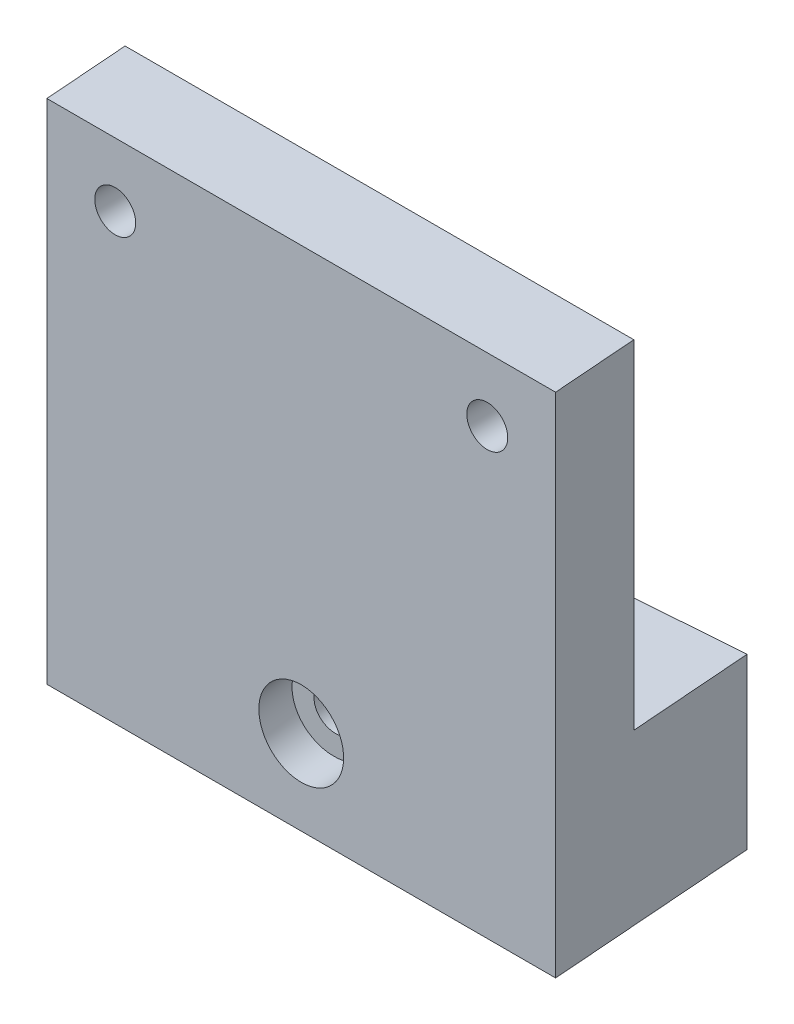
ISO-10303-21;
HEADER;
FILE_DESCRIPTION(('STEP AP214'),'2;1');
FILE_NAME('part.step','',(''),(''),'','','');
FILE_SCHEMA(('AUTOMOTIVE_DESIGN { 1 0 10303 214 1 1 1 1 }'));
ENDSEC;
DATA;
#1=APPLICATION_CONTEXT('core data for automotive mechanical design processes');
#2=APPLICATION_PROTOCOL_DEFINITION('international standard','automotive_design',2000,#1);
#3=PRODUCT_CONTEXT('',#1,'mechanical');
#4=PRODUCT('Part','Part','',(#3));
#5=PRODUCT_RELATED_PRODUCT_CATEGORY('part','',(#4));
#6=PRODUCT_DEFINITION_FORMATION('','',#4);
#7=PRODUCT_DEFINITION_CONTEXT('part definition',#1,'design');
#8=PRODUCT_DEFINITION('design','',#6,#7);
#9=PRODUCT_DEFINITION_SHAPE('','',#8);
#10=(LENGTH_UNIT() NAMED_UNIT(*) SI_UNIT(.MILLI.,.METRE.));
#11=(NAMED_UNIT(*) PLANE_ANGLE_UNIT() SI_UNIT($,.RADIAN.));
#12=(NAMED_UNIT(*) SI_UNIT($,.STERADIAN.) SOLID_ANGLE_UNIT());
#13=UNCERTAINTY_MEASURE_WITH_UNIT(LENGTH_MEASURE(1.E-05),#10,'distance_accuracy_value','');
#14=(GEOMETRIC_REPRESENTATION_CONTEXT(3) GLOBAL_UNCERTAINTY_ASSIGNED_CONTEXT((#13)) GLOBAL_UNIT_ASSIGNED_CONTEXT((#10,
#11,#12)) REPRESENTATION_CONTEXT('',''));
#15=CARTESIAN_POINT('',(0.,0.,0.));
#16=DIRECTION('',(0.,0.,1.));
#17=DIRECTION('',(1.,0.,0.));
#18=AXIS2_PLACEMENT_3D('',#15,#16,#17);
#19=CARTESIAN_POINT('',(0.,0.,332.955129639711));
#20=DIRECTION('',(0.,0.,1.));
#21=DIRECTION('',(1.,0.,0.));
#22=AXIS2_PLACEMENT_3D('',#19,#20,#21);
#23=PLANE('',#22);
#24=DIRECTION('',(-1.,0.,0.));
#25=VECTOR('',#24,1.);
#26=CARTESIAN_POINT('',(31.201050069516,-25.4,332.955129639711));
#27=LINE('',#26,#25);
#28=CARTESIAN_POINT('',(101.38564669068,-25.4,332.955129639711));
#29=VERTEX_POINT('',#28);
#30=CARTESIAN_POINT('',(24.9716347229783,-25.4,332.955129639711));
#31=VERTEX_POINT('',#30);
#32=EDGE_CURVE('E102',#29,#31,#27,.T.);
#33=ORIENTED_EDGE('',*,*,#32,.F.);
#34=DIRECTION('',(0.,1.,0.));
#35=VECTOR('',#34,1.);
#36=CARTESIAN_POINT('',(101.38564669068,-7.22333933655499E-13,332.955129639711));
#37=LINE('',#36,#35);
#38=CARTESIAN_POINT('',(101.38564669068,50.8,332.955129639711));
#39=VERTEX_POINT('',#38);
#40=EDGE_CURVE('E145',#29,#39,#37,.T.);
#41=ORIENTED_EDGE('',*,*,#40,.T.);
#42=DIRECTION('',(1.,0.,0.));
#43=VECTOR('',#42,1.);
#44=CARTESIAN_POINT('',(101.38564669068,50.8,332.955129639711));
#45=LINE('',#44,#43);
#46=CARTESIAN_POINT('',(24.9716347229785,50.8,332.955129639711));
#47=VERTEX_POINT('',#46);
#48=EDGE_CURVE('E181',#47,#39,#45,.T.);
#49=ORIENTED_EDGE('',*,*,#48,.F.);
#50=DIRECTION('',(0.,-1.,0.));
#51=VECTOR('',#50,1.);
#52=CARTESIAN_POINT('',(24.9716347229785,0.,332.955129639711));
#53=LINE('',#52,#51);
#54=EDGE_CURVE('E155',#47,#31,#53,.T.);
#55=ORIENTED_EDGE('',*,*,#54,.T.);
#56=EDGE_LOOP('',(#33,#41,#49,#55));
#57=FACE_BOUND('',#56,.T.);
#58=CARTESIAN_POINT('',(91.1186407068292,41.275,332.955129639711));
#59=DIRECTION('',(0.,0.,1.));
#60=DIRECTION('',(1.,0.,0.));
#61=AXIS2_PLACEMENT_3D('',#58,#59,#60);
#62=CIRCLE('',#61,3.0734);
#63=CARTESIAN_POINT('',(94.1920407068292,41.275,332.955129639711));
#64=VERTEX_POINT('',#63);
#65=EDGE_CURVE('E228',#64,#64,#62,.T.);
#66=ORIENTED_EDGE('',*,*,#65,.F.);
#67=EDGE_LOOP('',(#66));
#68=FACE_BOUND('',#67,.T.);
#69=CARTESIAN_POINT('',(35.2386407068292,41.275,332.955129639711));
#70=DIRECTION('',(0.,0.,1.));
#71=DIRECTION('',(1.,0.,0.));
#72=AXIS2_PLACEMENT_3D('',#69,#70,#71);
#73=CIRCLE('',#72,3.0734);
#74=CARTESIAN_POINT('',(38.3120407068292,41.275,332.955129639711));
#75=VERTEX_POINT('',#74);
#76=EDGE_CURVE('E177',#75,#75,#73,.T.);
#77=ORIENTED_EDGE('',*,*,#76,.F.);
#78=EDGE_LOOP('',(#77));
#79=FACE_BOUND('',#78,.T.);
#80=DIRECTION('',(0.,-1.,0.));
#81=VECTOR('',#80,1.);
#82=CARTESIAN_POINT('',(69.5286407068283,0.,332.955129639711));
#83=LINE('',#82,#81);
#84=CARTESIAN_POINT('',(69.5286407068283,-12.2268346567049,332.955129639711));
#85=VERTEX_POINT('',#84);
#86=CARTESIAN_POINT('',(69.5286407068283,-13.1766669993983,332.955129639711));
#87=VERTEX_POINT('',#86);
#88=EDGE_CURVE('E51',#85,#87,#83,.T.);
#89=ORIENTED_EDGE('',*,*,#88,.T.);
#90=CARTESIAN_POINT('',(63.1786407068292,-12.7017508280516,332.955129639711));
#91=DIRECTION('',(0.,0.,1.));
#92=DIRECTION('',(1.,0.,0.));
#93=AXIS2_PLACEMENT_3D('',#90,#91,#92);
#94=ELLIPSE('',#93,6.36783433064178,6.35);
#95=EDGE_CURVE('E12',#87,#85,#94,.F.);
#96=ORIENTED_EDGE('',*,*,#95,.T.);
#97=EDGE_LOOP('',(#89,#96));
#98=FACE_BOUND('',#97,.T.);
#99=ADVANCED_FACE('F42',(#57,#68,#79,#98),#23,.T.);
#100=CARTESIAN_POINT('',(31.201050069516,0.,416.014000926879));
#101=DIRECTION('',(0.,-1.,0.));
#102=DIRECTION('',(0.,0.,-1.));
#103=AXIS2_PLACEMENT_3D('',#100,#101,#102);
#104=PLANE('',#103);
#105=DIRECTION('',(-1.,0.,0.));
#106=VECTOR('',#105,1.);
#107=CARTESIAN_POINT('',(24.0191347229785,0.,320.255129639711));
#108=LINE('',#107,#106);
#109=CARTESIAN_POINT('',(100.43314669068,0.,320.255129639711));
#110=VERTEX_POINT('',#109);
#111=CARTESIAN_POINT('',(24.0191347229785,0.,320.255129639711));
#112=VERTEX_POINT('',#111);
#113=EDGE_CURVE('E65',#110,#112,#108,.T.);
#114=ORIENTED_EDGE('',*,*,#113,.F.);
#115=DIRECTION('',(-0.0747899482416342,0.,-0.997199309888456));
#116=VECTOR('',#115,1.);
#117=CARTESIAN_POINT('',(107.187637483017,0.,410.315006870867));
#118=LINE('',#117,#116);
#119=CARTESIAN_POINT('',(99.0532221364789,0.,301.856135583698));
#120=VERTEX_POINT('',#119);
#121=EDGE_CURVE('E170',#110,#120,#118,.T.);
#122=ORIENTED_EDGE('',*,*,#121,.T.);
#123=DIRECTION('',(-0.997199309888457,0.,0.0747899482416342));
#124=VECTOR('',#123,1.);
#125=CARTESIAN_POINT('',(23.0666347229783,0.,307.555129639711));
#126=LINE('',#125,#124);
#127=CARTESIAN_POINT('',(23.0666347229785,0.,307.555129639711));
#128=VERTEX_POINT('',#127);
#129=EDGE_CURVE('E213',#120,#128,#126,.T.);
#130=ORIENTED_EDGE('',*,*,#129,.T.);
#131=DIRECTION('',(-0.0747899482416342,0.,-0.997199309888456));
#132=VECTOR('',#131,1.);
#133=CARTESIAN_POINT('',(31.2010500695162,0.,416.014000926879));
#134=LINE('',#133,#132);
#135=EDGE_CURVE('E163',#112,#128,#134,.T.);
#136=ORIENTED_EDGE('',*,*,#135,.F.);
#137=EDGE_LOOP('',(#114,#122,#130,#136));
#138=FACE_BOUND('',#137,.T.);
#139=ADVANCED_FACE('F109',(#138),#104,.F.);
#140=CARTESIAN_POINT('',(69.1943437762664,-12.7017508280516,413.164503898873));
#141=DIRECTION('',(-0.0747899482416342,0.,-0.997199309888456));
#142=DIRECTION('',(-0.997199309888457,0.,0.0747899482416342));
#143=AXIS2_PLACEMENT_3D('',#140,#141,#142);
#144=CYLINDRICAL_SURFACE('',#143,3.26390000000057);
#145=CARTESIAN_POINT('',(62.739243491368,-12.7017508280516,327.096500100228));
#146=DIRECTION('',(-0.0747899482416342,0.,-0.997199309888456));
#147=DIRECTION('',(-0.997199309888456,0.,0.0747899482416342));
#148=AXIS2_PLACEMENT_3D('',#145,#146,#147);
#149=CIRCLE('',#148,3.26390000000057);
#150=CARTESIAN_POINT('',(59.4844846638225,-12.7017508280516,327.340607012294));
#151=VERTEX_POINT('',#150);
#152=EDGE_CURVE('E46',#151,#151,#149,.T.);
#153=CARTESIAN_POINT('',(61.0599284297287,-12.7017508280516,304.705632611704));
#154=DIRECTION('',(0.0747899482416342,0.,0.997199309888456));
#155=DIRECTION('',(0.997199309888456,0.,-0.0747899482416342));
#156=AXIS2_PLACEMENT_3D('',#153,#154,#155);
#157=CIRCLE('',#156,3.26390000000057);
#158=CARTESIAN_POINT('',(57.8051696021832,-12.7017508280516,304.94973952377));
#159=VERTEX_POINT('',#158);
#160=EDGE_CURVE('E154',#159,#159,#157,.T.);
#161=CARTESIAN_POINT('',(59.4844846638225,-12.7017508280516,327.340607012294));
#162=CARTESIAN_POINT('',(59.4669917985971,-12.7017508280516,327.107368809289));
#163=CARTESIAN_POINT('',(59.4494989333717,-12.7017508280516,326.874130606283));
#164=CARTESIAN_POINT('',(59.4145132029209,-12.7017508280516,326.407654200272));
#165=CARTESIAN_POINT('',(59.3970203376955,-12.7017508280516,326.174415997267));
#166=CARTESIAN_POINT('',(59.3620346072446,-12.7017508280516,325.707939591256));
#167=CARTESIAN_POINT('',(59.3445417420192,-12.7017508280516,325.474701388251));
#168=CARTESIAN_POINT('',(59.3095560115684,-12.7017508280516,325.00822498224));
#169=CARTESIAN_POINT('',(59.292063146343,-12.7017508280516,324.774986779234));
#170=CARTESIAN_POINT('',(59.2570774158922,-12.7017508280516,324.308510373223));
#171=CARTESIAN_POINT('',(59.2395845506668,-12.7017508280516,324.075272170218));
#172=CARTESIAN_POINT('',(59.204598820216,-12.7017508280516,323.608795764207));
#173=CARTESIAN_POINT('',(59.1871059549906,-12.7017508280516,323.375557561201));
#174=CARTESIAN_POINT('',(59.1521202245397,-12.7017508280516,322.90908115519));
#175=CARTESIAN_POINT('',(59.1346273593143,-12.7017508280516,322.675842952185));
#176=CARTESIAN_POINT('',(59.0996416288635,-12.7017508280516,322.209366546174));
#177=CARTESIAN_POINT('',(59.0821487636381,-12.7017508280516,321.976128343169));
#178=CARTESIAN_POINT('',(59.0471630331873,-12.7017508280516,321.509651937158));
#179=CARTESIAN_POINT('',(59.0296701679619,-12.7017508280516,321.276413734152));
#180=CARTESIAN_POINT('',(58.994684437511,-12.7017508280516,320.809937328141));
#181=CARTESIAN_POINT('',(58.9771915722856,-12.7017508280516,320.576699125136));
#182=CARTESIAN_POINT('',(58.9422058418348,-12.7017508280516,320.110222719125));
#183=CARTESIAN_POINT('',(58.9247129766094,-12.7017508280516,319.87698451612));
#184=CARTESIAN_POINT('',(58.8897272461586,-12.7017508280516,319.410508110109));
#185=CARTESIAN_POINT('',(58.8722343809332,-12.7017508280516,319.177269907103));
#186=CARTESIAN_POINT('',(58.8372486504824,-12.7017508280516,318.710793501092));
#187=CARTESIAN_POINT('',(58.819755785257,-12.7017508280516,318.477555298087));
#188=CARTESIAN_POINT('',(58.7847700548061,-12.7017508280516,318.011078892076));
#189=CARTESIAN_POINT('',(58.7672771895807,-12.7017508280516,317.77784068907));
#190=CARTESIAN_POINT('',(58.7322914591299,-12.7017508280516,317.311364283059));
#191=CARTESIAN_POINT('',(58.7147985939045,-12.7017508280516,317.078126080054));
#192=CARTESIAN_POINT('',(58.6798128634537,-12.7017508280516,316.611649674043));
#193=CARTESIAN_POINT('',(58.6623199982283,-12.7017508280516,316.378411471038));
#194=CARTESIAN_POINT('',(58.6273342677774,-12.7017508280516,315.911935065027));
#195=CARTESIAN_POINT('',(58.609841402552,-12.7017508280516,315.678696862021));
#196=CARTESIAN_POINT('',(58.5748556721012,-12.7017508280516,315.21222045601));
#197=CARTESIAN_POINT('',(58.5573628068758,-12.7017508280516,314.978982253005));
#198=CARTESIAN_POINT('',(58.522377076425,-12.7017508280516,314.512505846994));
#199=CARTESIAN_POINT('',(58.5048842111996,-12.7017508280516,314.279267643988));
#200=CARTESIAN_POINT('',(58.4698984807488,-12.7017508280516,313.812791237978));
#201=CARTESIAN_POINT('',(58.4524056155234,-12.7017508280516,313.579553034972));
#202=CARTESIAN_POINT('',(58.4174198850725,-12.7017508280516,313.113076628961));
#203=CARTESIAN_POINT('',(58.3999270198471,-12.7017508280516,312.879838425956));
#204=CARTESIAN_POINT('',(58.3649412893963,-12.7017508280516,312.413362019945));
#205=CARTESIAN_POINT('',(58.3474484241709,-12.7017508280516,312.180123816939));
#206=CARTESIAN_POINT('',(58.3124626937201,-12.7017508280516,311.713647410928));
#207=CARTESIAN_POINT('',(58.2949698284947,-12.7017508280516,311.480409207923));
#208=CARTESIAN_POINT('',(58.2599840980439,-12.7017508280516,311.013932801912));
#209=CARTESIAN_POINT('',(58.2424912328184,-12.7017508280516,310.780694598907));
#210=CARTESIAN_POINT('',(58.2075055023676,-12.7017508280516,310.314218192896));
#211=CARTESIAN_POINT('',(58.1900126371422,-12.7017508280516,310.08097998989));
#212=CARTESIAN_POINT('',(58.1550269066914,-12.7017508280516,309.614503583879));
#213=CARTESIAN_POINT('',(58.137534041466,-12.7017508280516,309.381265380874));
#214=CARTESIAN_POINT('',(58.1025483110152,-12.7017508280516,308.914788974863));
#215=CARTESIAN_POINT('',(58.0850554457898,-12.7017508280516,308.681550771857));
#216=CARTESIAN_POINT('',(58.0500697153389,-12.7017508280516,308.215074365846));
#217=CARTESIAN_POINT('',(58.0325768501135,-12.7017508280516,307.981836162841));
#218=CARTESIAN_POINT('',(57.9975911196627,-12.7017508280516,307.51535975683));
#219=CARTESIAN_POINT('',(57.9800982544373,-12.7017508280516,307.282121553825));
#220=CARTESIAN_POINT('',(57.9451125239865,-12.7017508280516,306.815645147814));
#221=CARTESIAN_POINT('',(57.9276196587611,-12.7017508280516,306.582406944808));
#222=CARTESIAN_POINT('',(57.8926339283103,-12.7017508280516,306.115930538797));
#223=CARTESIAN_POINT('',(57.8751410630848,-12.7017508280516,305.882692335792));
#224=CARTESIAN_POINT('',(57.840155332634,-12.7017508280516,305.416215929781));
#225=CARTESIAN_POINT('',(57.8226624674086,-12.7017508280516,305.182977726776));
#226=CARTESIAN_POINT('',(57.8051696021832,-12.7017508280516,304.94973952377));
#227=B_SPLINE_CURVE_WITH_KNOTS('',3,(#161,#162,#163,#164,#165,#166,#167,#168,#169,#170,#171,
#172,#173,#174,#175,#176,#177,#178,#179,#180,#181,#182,#183,#184,#185,#186,#187,#188,#189,#190,
#191,#192,#193,#194,#195,#196,#197,#198,#199,#200,#201,#202,#203,#204,#205,#206,#207,#208,#209,
#210,#211,#212,#213,#214,#215,#216,#217,#218,#219,#220,#221,#222,#223,#224,#225,#226),
.UNSPECIFIED.,.F.,.F.,(4,2,2,2,2,2,2,2,2,2,2,2,2,2,2,2,2,2,2,2,2,2,2,2,2,2,2,2,2,2,2,2,4),(0.,
0.701679796684455,1.40335959336885,2.10503939005331,2.80671918673771,3.50839898342211,
4.21007878010656,4.91175857679096,5.61343837347542,6.31511817015982,7.01679796684427,
7.71847776352867,8.42015756021307,9.12183735689752,9.82351715358192,10.5251969502663,
11.2268767469508,11.9285565436352,12.6302363403196,13.331916137004,14.0335959336885,
14.7352757303729,15.4369555270573,16.1386353237417,16.8403151204261,17.5419949171106,
18.243674713795,18.9453545104794,19.6470343071638,20.3487141038482,21.0503939005327,
21.7520736972171,22.4537534939016),.UNSPECIFIED.);
#228=EDGE_CURVE('BSEAM44',#151,#159,#227,.T.);
#229=ORIENTED_EDGE('',*,*,#152,.F.);
#230=ORIENTED_EDGE('',*,*,#160,.F.);
#231=ORIENTED_EDGE('',*,*,#228,.T.);
#232=ORIENTED_EDGE('',*,*,#228,.F.);
#233=EDGE_LOOP('',(#229,#231,#230,#232));
#234=FACE_BOUND('',#233,.T.);
#235=ADVANCED_FACE('F44',(#234),#144,.F.);
#236=CARTESIAN_POINT('',(23.0666347229783,0.,307.555129639711));
#237=DIRECTION('',(0.0747899482416342,0.,0.997199309888456));
#238=DIRECTION('',(0.997199309888456,0.,-0.0747899482416342));
#239=AXIS2_PLACEMENT_3D('',#236,#237,#238);
#240=PLANE('',#239);
#241=CARTESIAN_POINT('',(42.0632815763536,-12.7017508280516,306.130381125707));
#242=DIRECTION('',(0.0747899482416342,0.,0.997199309888456));
#243=DIRECTION('',(0.997199309888456,0.,-0.0747899482416342));
#244=AXIS2_PLACEMENT_3D('',#241,#242,#243);
#245=CIRCLE('',#244,2.3622000000004);
#246=CARTESIAN_POINT('',(44.4188657861725,-12.7017508280516,305.953712309971));
#247=VERTEX_POINT('',#246);
#248=EDGE_CURVE('E200',#247,#247,#245,.T.);
#249=ORIENTED_EDGE('',*,*,#248,.T.);
#250=EDGE_LOOP('',(#249));
#251=FACE_BOUND('',#250,.T.);
#252=CARTESIAN_POINT('',(80.0565752831038,-12.7017508280516,303.280884097701));
#253=DIRECTION('',(0.0747899482416342,0.,0.997199309888456));
#254=DIRECTION('',(0.997199309888456,0.,-0.0747899482416342));
#255=AXIS2_PLACEMENT_3D('',#252,#253,#254);
#256=CIRCLE('',#255,2.36220000000041);
#257=CARTESIAN_POINT('',(82.4121594929227,-12.7017508280516,303.104215281965));
#258=VERTEX_POINT('',#257);
#259=EDGE_CURVE('E196',#258,#258,#256,.T.);
#260=ORIENTED_EDGE('',*,*,#259,.T.);
#261=EDGE_LOOP('',(#260));
#262=FACE_BOUND('',#261,.T.);
#263=ORIENTED_EDGE('',*,*,#160,.T.);
#264=EDGE_LOOP('',(#263));
#265=FACE_BOUND('',#264,.T.);
#266=DIRECTION('',(0.,1.,0.));
#267=VECTOR('',#266,1.);
#268=CARTESIAN_POINT('',(99.0532221364789,-7.82398205812949E-13,301.856135583698));
#269=LINE('',#268,#267);
#270=CARTESIAN_POINT('',(99.0532221364786,-25.4,301.856135583698));
#271=VERTEX_POINT('',#270);
#272=EDGE_CURVE('E211',#271,#120,#269,.T.);
#273=ORIENTED_EDGE('',*,*,#272,.F.);
#274=DIRECTION('',(-0.997199309888456,0.,0.0747899482416342));
#275=VECTOR('',#274,1.);
#276=CARTESIAN_POINT('',(23.0666347229783,-25.4,307.555129639711));
#277=LINE('',#276,#275);
#278=CARTESIAN_POINT('',(23.0666347229783,-25.4,307.555129639711));
#279=VERTEX_POINT('',#278);
#280=EDGE_CURVE('E160',#271,#279,#277,.T.);
#281=ORIENTED_EDGE('',*,*,#280,.T.);
#282=DIRECTION('',(0.,-1.,0.));
#283=VECTOR('',#282,1.);
#284=CARTESIAN_POINT('',(23.0666347229785,0.,307.555129639711));
#285=LINE('',#284,#283);
#286=EDGE_CURVE('E165',#128,#279,#285,.T.);
#287=ORIENTED_EDGE('',*,*,#286,.F.);
#288=ORIENTED_EDGE('',*,*,#129,.F.);
#289=EDGE_LOOP('',(#273,#281,#287,#288));
#290=FACE_BOUND('',#289,.T.);
#291=ADVANCED_FACE('F123',(#251,#262,#265,#290),#240,.F.);
#292=CARTESIAN_POINT('',(31.201050069516,-25.4,416.014000926879));
#293=DIRECTION('',(0.,-1.,0.));
#294=DIRECTION('',(1.,0.,0.));
#295=AXIS2_PLACEMENT_3D('',#292,#293,#294);
#296=PLANE('',#295);
#297=DIRECTION('',(-0.0747899482416342,0.,-0.997199309888456));
#298=VECTOR('',#297,1.);
#299=CARTESIAN_POINT('',(107.187637483016,-25.4,410.315006870867));
#300=LINE('',#299,#298);
#301=EDGE_CURVE('E148',#29,#271,#300,.T.);
#302=ORIENTED_EDGE('',*,*,#301,.F.);
#303=ORIENTED_EDGE('',*,*,#32,.T.);
#304=DIRECTION('',(-0.0747899482416342,0.,-0.997199309888456));
#305=VECTOR('',#304,1.);
#306=CARTESIAN_POINT('',(31.2010500695159,-25.4,416.014000926879));
#307=LINE('',#306,#305);
#308=EDGE_CURVE('E161',#31,#279,#307,.T.);
#309=ORIENTED_EDGE('',*,*,#308,.T.);
#310=ORIENTED_EDGE('',*,*,#280,.F.);
#311=EDGE_LOOP('',(#302,#303,#309,#310));
#312=FACE_BOUND('',#311,.T.);
#313=ADVANCED_FACE('F126',(#312),#296,.T.);
#314=CARTESIAN_POINT('',(31.2010500695162,0.,416.014000926879));
#315=DIRECTION('',(0.997199309888456,0.,-0.0747899482416342));
#316=DIRECTION('',(-0.0747899482416342,0.,-0.997199309888457));
#317=AXIS2_PLACEMENT_3D('',#314,#315,#316);
#318=PLANE('',#317);
#319=ORIENTED_EDGE('',*,*,#54,.F.);
#320=DIRECTION('',(0.0747899482416342,0.,0.997199309888456));
#321=VECTOR('',#320,1.);
#322=CARTESIAN_POINT('',(24.9716347229785,50.8,332.955129639711));
#323=LINE('',#322,#321);
#324=CARTESIAN_POINT('',(24.0191347229785,50.8,320.255129639711));
#325=VERTEX_POINT('',#324);
#326=EDGE_CURVE('E190',#325,#47,#323,.T.);
#327=ORIENTED_EDGE('',*,*,#326,.F.);
#328=DIRECTION('',(0.,-1.,0.));
#329=VECTOR('',#328,1.);
#330=CARTESIAN_POINT('',(24.0191347229785,50.8,320.255129639711));
#331=LINE('',#330,#329);
#332=EDGE_CURVE('E192',#325,#112,#331,.T.);
#333=ORIENTED_EDGE('',*,*,#332,.T.);
#334=ORIENTED_EDGE('',*,*,#135,.T.);
#335=ORIENTED_EDGE('',*,*,#286,.T.);
#336=ORIENTED_EDGE('',*,*,#308,.F.);
#337=EDGE_LOOP('',(#319,#327,#333,#334,#335,#336));
#338=FACE_BOUND('',#337,.T.);
#339=ADVANCED_FACE('F130',(#338),#318,.F.);
#340=CARTESIAN_POINT('',(107.187637483017,-7.82564529895653E-13,410.315006870867));
#341=DIRECTION('',(-0.997199309888456,0.,0.0747899482416342));
#342=DIRECTION('',(0.0747899482416342,0.,0.997199309888457));
#343=AXIS2_PLACEMENT_3D('',#340,#341,#342);
#344=PLANE('',#343);
#345=ORIENTED_EDGE('',*,*,#40,.F.);
#346=ORIENTED_EDGE('',*,*,#301,.T.);
#347=ORIENTED_EDGE('',*,*,#272,.T.);
#348=ORIENTED_EDGE('',*,*,#121,.F.);
#349=DIRECTION('',(0.,-1.,0.));
#350=VECTOR('',#349,1.);
#351=CARTESIAN_POINT('',(100.43314669068,50.8,320.255129639711));
#352=LINE('',#351,#350);
#353=CARTESIAN_POINT('',(100.43314669068,50.8,320.255129639711));
#354=VERTEX_POINT('',#353);
#355=EDGE_CURVE('E194',#354,#110,#352,.T.);
#356=ORIENTED_EDGE('',*,*,#355,.F.);
#357=DIRECTION('',(-0.0747899482416339,0.,-0.997199309888456));
#358=VECTOR('',#357,1.);
#359=CARTESIAN_POINT('',(100.43314669068,50.8,320.255129639711));
#360=LINE('',#359,#358);
#361=EDGE_CURVE('E151',#39,#354,#360,.T.);
#362=ORIENTED_EDGE('',*,*,#361,.F.);
#363=EDGE_LOOP('',(#345,#346,#347,#348,#356,#362));
#364=FACE_BOUND('',#363,.T.);
#365=ADVANCED_FACE('F133',(#364),#344,.F.);
#366=CARTESIAN_POINT('',(79.5816591117694,-12.7017508280516,296.948668479909));
#367=DIRECTION('',(0.0747899482416342,0.,0.997199309888456));
#368=DIRECTION('',(0.997199309888457,0.,-0.0747899482416342));
#369=AXIS2_PLACEMENT_3D('',#366,#367,#368);
#370=CYLINDRICAL_SURFACE('',#369,2.36220000000041);
#371=CARTESIAN_POINT('',(79.5816591117694,-12.7017508280516,296.948668479909));
#372=DIRECTION('',(0.0747899482416342,0.,0.997199309888456));
#373=DIRECTION('',(0.997199309888456,0.,-0.0747899482416342));
#374=AXIS2_PLACEMENT_3D('',#371,#372,#373);
#375=CIRCLE('',#374,2.36220000000041);
#376=CARTESIAN_POINT('',(81.9372433215883,-12.7017508280516,296.771999664173));
#377=VERTEX_POINT('',#376);
#378=EDGE_CURVE('E203',#377,#377,#375,.T.);
#379=CARTESIAN_POINT('',(81.9372433215883,-12.7017508280516,296.771999664173));
#380=CARTESIAN_POINT('',(81.9421903650397,-12.7017508280516,296.837960243525));
#381=CARTESIAN_POINT('',(81.9471374084911,-12.7017508280516,296.903920822877));
#382=CARTESIAN_POINT('',(81.9570314953939,-12.7017508280516,297.035841981581));
#383=CARTESIAN_POINT('',(81.9619785388453,-12.7017508280516,297.101802560933));
#384=CARTESIAN_POINT('',(81.9718726257481,-12.7017508280516,297.233723719637));
#385=CARTESIAN_POINT('',(81.9768196691995,-12.7017508280516,297.299684298989));
#386=CARTESIAN_POINT('',(81.9867137561023,-12.7017508280516,297.431605457693));
#387=CARTESIAN_POINT('',(81.9916607995537,-12.7017508280516,297.497566037045));
#388=CARTESIAN_POINT('',(82.0015548864565,-12.7017508280516,297.629487195749));
#389=CARTESIAN_POINT('',(82.0065019299079,-12.7017508280516,297.695447775101));
#390=CARTESIAN_POINT('',(82.0163960168107,-12.7017508280516,297.827368933805));
#391=CARTESIAN_POINT('',(82.0213430602621,-12.7017508280516,297.893329513157));
#392=CARTESIAN_POINT('',(82.0312371471649,-12.7017508280516,298.025250671861));
#393=CARTESIAN_POINT('',(82.0361841906163,-12.7017508280516,298.091211251213));
#394=CARTESIAN_POINT('',(82.0460782775191,-12.7017508280516,298.223132409917));
#395=CARTESIAN_POINT('',(82.0510253209705,-12.7017508280516,298.289092989269));
#396=CARTESIAN_POINT('',(82.0609194078733,-12.7017508280516,298.421014147973));
#397=CARTESIAN_POINT('',(82.0658664513247,-12.7017508280516,298.486974727325));
#398=CARTESIAN_POINT('',(82.0757605382275,-12.7017508280516,298.618895886029));
#399=CARTESIAN_POINT('',(82.0807075816789,-12.7017508280516,298.684856465381));
#400=CARTESIAN_POINT('',(82.0906016685817,-12.7017508280516,298.816777624085));
#401=CARTESIAN_POINT('',(82.0955487120331,-12.7017508280516,298.882738203437));
#402=CARTESIAN_POINT('',(82.1054427989359,-12.7017508280516,299.014659362141));
#403=CARTESIAN_POINT('',(82.1103898423873,-12.7017508280516,299.080619941493));
#404=CARTESIAN_POINT('',(82.1202839292901,-12.7017508280516,299.212541100197));
#405=CARTESIAN_POINT('',(82.1252309727415,-12.7017508280516,299.278501679549));
#406=CARTESIAN_POINT('',(82.1351250596443,-12.7017508280516,299.410422838253));
#407=CARTESIAN_POINT('',(82.1400721030957,-12.7017508280516,299.476383417605));
#408=CARTESIAN_POINT('',(82.1499661899985,-12.7017508280516,299.608304576309));
#409=CARTESIAN_POINT('',(82.1549132334499,-12.7017508280516,299.674265155661));
#410=CARTESIAN_POINT('',(82.1648073203527,-12.7017508280516,299.806186314365));
#411=CARTESIAN_POINT('',(82.1697543638041,-12.7017508280516,299.872146893717));
#412=CARTESIAN_POINT('',(82.1796484507069,-12.7017508280516,300.004068052421));
#413=CARTESIAN_POINT('',(82.1845954941583,-12.7017508280516,300.070028631773));
#414=CARTESIAN_POINT('',(82.1944895810611,-12.7017508280516,300.201949790477));
#415=CARTESIAN_POINT('',(82.1994366245125,-12.7017508280516,300.267910369829));
#416=CARTESIAN_POINT('',(82.2093307114153,-12.7017508280516,300.399831528533));
#417=CARTESIAN_POINT('',(82.2142777548667,-12.7017508280516,300.465792107885));
#418=CARTESIAN_POINT('',(82.2241718417695,-12.7017508280516,300.597713266589));
#419=CARTESIAN_POINT('',(82.2291188852209,-12.7017508280516,300.663673845941));
#420=CARTESIAN_POINT('',(82.2390129721237,-12.7017508280516,300.795595004645));
#421=CARTESIAN_POINT('',(82.2439600155751,-12.7017508280516,300.861555583997));
#422=CARTESIAN_POINT('',(82.2538541024779,-12.7017508280516,300.993476742701));
#423=CARTESIAN_POINT('',(82.2588011459293,-12.7017508280516,301.059437322053));
#424=CARTESIAN_POINT('',(82.2686952328321,-12.7017508280516,301.191358480757));
#425=CARTESIAN_POINT('',(82.2736422762835,-12.7017508280516,301.257319060109));
#426=CARTESIAN_POINT('',(82.2835363631863,-12.7017508280516,301.389240218813));
#427=CARTESIAN_POINT('',(82.2884834066377,-12.7017508280516,301.455200798165));
#428=CARTESIAN_POINT('',(82.2983774935405,-12.7017508280516,301.587121956869));
#429=CARTESIAN_POINT('',(82.3033245369919,-12.7017508280516,301.653082536221));
#430=CARTESIAN_POINT('',(82.3132186238947,-12.7017508280516,301.785003694925));
#431=CARTESIAN_POINT('',(82.3181656673461,-12.7017508280516,301.850964274277));
#432=CARTESIAN_POINT('',(82.3280597542489,-12.7017508280516,301.982885432981));
#433=CARTESIAN_POINT('',(82.3330067977003,-12.7017508280516,302.048846012333));
#434=CARTESIAN_POINT('',(82.3429008846031,-12.7017508280516,302.180767171037));
#435=CARTESIAN_POINT('',(82.3478479280545,-12.7017508280516,302.246727750389));
#436=CARTESIAN_POINT('',(82.3577420149573,-12.7017508280516,302.378648909093));
#437=CARTESIAN_POINT('',(82.3626890584087,-12.7017508280516,302.444609488445));
#438=CARTESIAN_POINT('',(82.3725831453115,-12.7017508280516,302.576530647149));
#439=CARTESIAN_POINT('',(82.3775301887629,-12.7017508280516,302.642491226501));
#440=CARTESIAN_POINT('',(82.3874242756657,-12.7017508280516,302.774412385205));
#441=CARTESIAN_POINT('',(82.3923713191171,-12.7017508280516,302.840372964557));
#442=CARTESIAN_POINT('',(82.4022654060199,-12.7017508280516,302.972294123261));
#443=CARTESIAN_POINT('',(82.4072124494713,-12.7017508280516,303.038254702613));
#444=CARTESIAN_POINT('',(82.4121594929227,-12.7017508280516,303.104215281965));
#445=B_SPLINE_CURVE_WITH_KNOTS('',3,(#379,#380,#381,#382,#383,#384,#385,#386,#387,#388,#389,
#390,#391,#392,#393,#394,#395,#396,#397,#398,#399,#400,#401,#402,#403,#404,#405,#406,#407,#408,
#409,#410,#411,#412,#413,#414,#415,#416,#417,#418,#419,#420,#421,#422,#423,#424,#425,#426,#427,
#428,#429,#430,#431,#432,#433,#434,#435,#436,#437,#438,#439,#440,#441,#442,#443,#444),
.UNSPECIFIED.,.F.,.F.,(4,2,2,2,2,2,2,2,2,2,2,2,2,2,2,2,2,2,2,2,2,2,2,2,2,2,2,2,2,2,2,2,4),(0.,
0.19843749999997,0.396874999999996,0.595312499999965,0.79374999999999,0.992187499999961,
1.19062499999999,1.38906249999996,1.58749999999998,1.78593749999995,1.98437499999998,
2.18281249999995,2.38124999999997,2.57968749999994,2.77812499999997,2.97656249999994,
3.17499999999996,3.37343749999999,3.57187499999996,3.77031249999998,3.96874999999995,
4.16718749999998,4.36562499999995,4.56406249999998,4.76249999999995,4.96093749999997,
5.15937499999994,5.35781249999997,5.55624999999994,5.75468749999996,5.95312499999993,
6.15156249999996,6.34999999999993),.UNSPECIFIED.);
#446=EDGE_CURVE('BSEAM121',#377,#258,#445,.T.);
#447=ORIENTED_EDGE('',*,*,#378,.T.);
#448=ORIENTED_EDGE('',*,*,#259,.F.);
#449=ORIENTED_EDGE('',*,*,#446,.T.);
#450=ORIENTED_EDGE('',*,*,#446,.F.);
#451=EDGE_LOOP('',(#447,#449,#448,#450));
#452=FACE_BOUND('',#451,.T.);
#453=ADVANCED_FACE('F121',(#452),#370,.T.);
#454=CARTESIAN_POINT('',(22.5917185516439,0.,301.222914021919));
#455=DIRECTION('',(0.0747899482416342,0.,0.997199309888456));
#456=DIRECTION('',(0.997199309888456,0.,-0.0747899482416342));
#457=AXIS2_PLACEMENT_3D('',#454,#455,#456);
#458=PLANE('',#457);
#459=ORIENTED_EDGE('',*,*,#378,.F.);
#460=EDGE_LOOP('',(#459));
#461=FACE_BOUND('',#460,.T.);
#462=ADVANCED_FACE('F141',(#461),#458,.F.);
#463=CARTESIAN_POINT('',(41.5883654050192,-12.7017508280516,299.798165507916));
#464=DIRECTION('',(0.0747899482416342,0.,0.997199309888456));
#465=DIRECTION('',(0.997199309888457,0.,-0.0747899482416342));
#466=AXIS2_PLACEMENT_3D('',#463,#464,#465);
#467=CYLINDRICAL_SURFACE('',#466,2.3622000000004);
#468=CARTESIAN_POINT('',(41.5883654050192,-12.7017508280516,299.798165507916));
#469=DIRECTION('',(0.0747899482416342,0.,0.997199309888456));
#470=DIRECTION('',(0.997199309888456,0.,-0.0747899482416342));
#471=AXIS2_PLACEMENT_3D('',#468,#469,#470);
#472=CIRCLE('',#471,2.3622000000004);
#473=CARTESIAN_POINT('',(43.9439496148381,-12.7017508280516,299.621496692179));
#474=VERTEX_POINT('',#473);
#475=EDGE_CURVE('E197',#474,#474,#472,.T.);
#476=CARTESIAN_POINT('',(43.9439496148381,-12.7017508280516,299.621496692179));
#477=CARTESIAN_POINT('',(43.9488966582895,-12.7017508280516,299.687457271531));
#478=CARTESIAN_POINT('',(43.9538437017409,-12.7017508280516,299.753417850883));
#479=CARTESIAN_POINT('',(43.9637377886437,-12.7017508280516,299.885339009587));
#480=CARTESIAN_POINT('',(43.9686848320951,-12.7017508280516,299.951299588939));
#481=CARTESIAN_POINT('',(43.9785789189979,-12.7017508280516,300.083220747643));
#482=CARTESIAN_POINT('',(43.9835259624493,-12.7017508280516,300.149181326995));
#483=CARTESIAN_POINT('',(43.9934200493521,-12.7017508280516,300.281102485699));
#484=CARTESIAN_POINT('',(43.9983670928035,-12.7017508280516,300.347063065051));
#485=CARTESIAN_POINT('',(44.0082611797063,-12.7017508280516,300.478984223755));
#486=CARTESIAN_POINT('',(44.0132082231577,-12.7017508280516,300.544944803107));
#487=CARTESIAN_POINT('',(44.0231023100605,-12.7017508280516,300.676865961811));
#488=CARTESIAN_POINT('',(44.0280493535119,-12.7017508280516,300.742826541163));
#489=CARTESIAN_POINT('',(44.0379434404147,-12.7017508280516,300.874747699867));
#490=CARTESIAN_POINT('',(44.0428904838661,-12.7017508280516,300.940708279219));
#491=CARTESIAN_POINT('',(44.0527845707689,-12.7017508280516,301.072629437923));
#492=CARTESIAN_POINT('',(44.0577316142203,-12.7017508280516,301.138590017275));
#493=CARTESIAN_POINT('',(44.0676257011231,-12.7017508280516,301.270511175979));
#494=CARTESIAN_POINT('',(44.0725727445745,-12.7017508280516,301.336471755331));
#495=CARTESIAN_POINT('',(44.0824668314773,-12.7017508280516,301.468392914035));
#496=CARTESIAN_POINT('',(44.0874138749287,-12.7017508280516,301.534353493387));
#497=CARTESIAN_POINT('',(44.0973079618315,-12.7017508280516,301.666274652091));
#498=CARTESIAN_POINT('',(44.1022550052829,-12.7017508280516,301.732235231443));
#499=CARTESIAN_POINT('',(44.1121490921857,-12.7017508280516,301.864156390147));
#500=CARTESIAN_POINT('',(44.1170961356371,-12.7017508280516,301.930116969499));
#501=CARTESIAN_POINT('',(44.1269902225399,-12.7017508280516,302.062038128203));
#502=CARTESIAN_POINT('',(44.1319372659913,-12.7017508280516,302.127998707555));
#503=CARTESIAN_POINT('',(44.1418313528941,-12.7017508280516,302.259919866259));
#504=CARTESIAN_POINT('',(44.1467783963455,-12.7017508280516,302.325880445611));
#505=CARTESIAN_POINT('',(44.1566724832483,-12.7017508280516,302.457801604315));
#506=CARTESIAN_POINT('',(44.1616195266997,-12.7017508280516,302.523762183667));
#507=CARTESIAN_POINT('',(44.1715136136025,-12.7017508280516,302.655683342371));
#508=CARTESIAN_POINT('',(44.1764606570539,-12.7017508280516,302.721643921723));
#509=CARTESIAN_POINT('',(44.1863547439567,-12.7017508280516,302.853565080427));
#510=CARTESIAN_POINT('',(44.1913017874081,-12.7017508280516,302.919525659779));
#511=CARTESIAN_POINT('',(44.2011958743109,-12.7017508280516,303.051446818483));
#512=CARTESIAN_POINT('',(44.2061429177623,-12.7017508280516,303.117407397835));
#513=CARTESIAN_POINT('',(44.2160370046651,-12.7017508280516,303.249328556539));
#514=CARTESIAN_POINT('',(44.2209840481165,-12.7017508280516,303.315289135891));
#515=CARTESIAN_POINT('',(44.2308781350193,-12.7017508280516,303.447210294595));
#516=CARTESIAN_POINT('',(44.2358251784707,-12.7017508280516,303.513170873947));
#517=CARTESIAN_POINT('',(44.2457192653735,-12.7017508280516,303.645092032651));
#518=CARTESIAN_POINT('',(44.2506663088249,-12.7017508280516,303.711052612003));
#519=CARTESIAN_POINT('',(44.2605603957277,-12.7017508280516,303.842973770707));
#520=CARTESIAN_POINT('',(44.2655074391791,-12.7017508280516,303.908934350059));
#521=CARTESIAN_POINT('',(44.2754015260819,-12.7017508280516,304.040855508763));
#522=CARTESIAN_POINT('',(44.2803485695333,-12.7017508280516,304.106816088115));
#523=CARTESIAN_POINT('',(44.2902426564361,-12.7017508280516,304.238737246819));
#524=CARTESIAN_POINT('',(44.2951896998875,-12.7017508280516,304.304697826171));
#525=CARTESIAN_POINT('',(44.3050837867903,-12.7017508280516,304.436618984875));
#526=CARTESIAN_POINT('',(44.3100308302417,-12.7017508280516,304.502579564227));
#527=CARTESIAN_POINT('',(44.3199249171445,-12.7017508280516,304.634500722931));
#528=CARTESIAN_POINT('',(44.3248719605959,-12.7017508280516,304.700461302283));
#529=CARTESIAN_POINT('',(44.3347660474987,-12.7017508280516,304.832382460987));
#530=CARTESIAN_POINT('',(44.3397130909501,-12.7017508280516,304.898343040339));
#531=CARTESIAN_POINT('',(44.3496071778529,-12.7017508280516,305.030264199043));
#532=CARTESIAN_POINT('',(44.3545542213043,-12.7017508280516,305.096224778395));
#533=CARTESIAN_POINT('',(44.3644483082071,-12.7017508280516,305.228145937099));
#534=CARTESIAN_POINT('',(44.3693953516585,-12.7017508280516,305.294106516451));
#535=CARTESIAN_POINT('',(44.3792894385613,-12.7017508280516,305.426027675155));
#536=CARTESIAN_POINT('',(44.3842364820127,-12.7017508280516,305.491988254507));
#537=CARTESIAN_POINT('',(44.3941305689155,-12.7017508280516,305.623909413211));
#538=CARTESIAN_POINT('',(44.3990776123669,-12.7017508280516,305.689869992563));
#539=CARTESIAN_POINT('',(44.4089716992697,-12.7017508280516,305.821791151267));
#540=CARTESIAN_POINT('',(44.4139187427211,-12.7017508280516,305.887751730619));
#541=CARTESIAN_POINT('',(44.4188657861725,-12.7017508280516,305.953712309971));
#542=B_SPLINE_CURVE_WITH_KNOTS('',3,(#476,#477,#478,#479,#480,#481,#482,#483,#484,#485,#486,
#487,#488,#489,#490,#491,#492,#493,#494,#495,#496,#497,#498,#499,#500,#501,#502,#503,#504,#505,
#506,#507,#508,#509,#510,#511,#512,#513,#514,#515,#516,#517,#518,#519,#520,#521,#522,#523,#524,
#525,#526,#527,#528,#529,#530,#531,#532,#533,#534,#535,#536,#537,#538,#539,#540,#541),
.UNSPECIFIED.,.F.,.F.,(4,2,2,2,2,2,2,2,2,2,2,2,2,2,2,2,2,2,2,2,2,2,2,2,2,2,2,2,2,2,2,2,4),(0.,
0.19843749999997,0.396874999999995,0.595312499999965,0.793749999999991,0.992187499999961,
1.19062499999999,1.38906249999996,1.58749999999998,1.78593749999995,1.98437499999998,
2.18281249999995,2.38124999999997,2.57968749999994,2.77812499999997,2.97656249999994,
3.17499999999996,3.37343749999999,3.57187499999996,3.77031249999998,3.96874999999995,
4.16718749999998,4.36562499999995,4.56406249999998,4.76249999999995,4.96093749999997,
5.15937499999994,5.35781249999997,5.55624999999994,5.75468749999996,5.95312499999993,
6.15156249999996,6.34999999999993),.UNSPECIFIED.);
#543=EDGE_CURVE('BSEAM324',#474,#247,#542,.T.);
#544=ORIENTED_EDGE('',*,*,#475,.T.);
#545=ORIENTED_EDGE('',*,*,#248,.F.);
#546=ORIENTED_EDGE('',*,*,#543,.T.);
#547=ORIENTED_EDGE('',*,*,#543,.F.);
#548=EDGE_LOOP('',(#544,#546,#545,#547));
#549=FACE_BOUND('',#548,.T.);
#550=ADVANCED_FACE('F324',(#549),#467,.T.);
#551=CARTESIAN_POINT('',(22.5917185516439,0.,301.222914021919));
#552=DIRECTION('',(0.0747899482416342,0.,0.997199309888456));
#553=DIRECTION('',(0.997199309888456,0.,-0.0747899482416342));
#554=AXIS2_PLACEMENT_3D('',#551,#552,#553);
#555=PLANE('',#554);
#556=ORIENTED_EDGE('',*,*,#475,.F.);
#557=EDGE_LOOP('',(#556));
#558=FACE_BOUND('',#557,.T.);
#559=ADVANCED_FACE('F309',(#558),#555,.F.);
#560=CARTESIAN_POINT('',(24.0191347229785,50.8,320.255129639711));
#561=DIRECTION('',(0.,0.,1.));
#562=DIRECTION('',(0.,-1.,0.));
#563=AXIS2_PLACEMENT_3D('',#560,#561,#562);
#564=PLANE('',#563);
#565=CARTESIAN_POINT('',(35.2386407068292,41.275,320.255129639711));
#566=DIRECTION('',(0.,0.,1.));
#567=DIRECTION('',(0.,-1.,0.));
#568=AXIS2_PLACEMENT_3D('',#565,#566,#567);
#569=CIRCLE('',#568,3.0734);
#570=CARTESIAN_POINT('',(35.2386407068292,38.2016,320.255129639711));
#571=VERTEX_POINT('',#570);
#572=EDGE_CURVE('E176',#571,#571,#569,.T.);
#573=ORIENTED_EDGE('',*,*,#572,.T.);
#574=EDGE_LOOP('',(#573));
#575=FACE_BOUND('',#574,.T.);
#576=CARTESIAN_POINT('',(91.1186407068292,41.275,320.255129639711));
#577=DIRECTION('',(0.,0.,1.));
#578=DIRECTION('',(0.,-1.,0.));
#579=AXIS2_PLACEMENT_3D('',#576,#577,#578);
#580=CIRCLE('',#579,3.0734);
#581=CARTESIAN_POINT('',(91.1186407068292,38.2016,320.255129639711));
#582=VERTEX_POINT('',#581);
#583=EDGE_CURVE('E173',#582,#582,#580,.T.);
#584=ORIENTED_EDGE('',*,*,#583,.T.);
#585=EDGE_LOOP('',(#584));
#586=FACE_BOUND('',#585,.T.);
#587=ORIENTED_EDGE('',*,*,#113,.T.);
#588=ORIENTED_EDGE('',*,*,#332,.F.);
#589=DIRECTION('',(-1.,0.,0.));
#590=VECTOR('',#589,1.);
#591=CARTESIAN_POINT('',(24.0191347229785,50.8,320.255129639711));
#592=LINE('',#591,#590);
#593=EDGE_CURVE('E222',#354,#325,#592,.T.);
#594=ORIENTED_EDGE('',*,*,#593,.F.);
#595=ORIENTED_EDGE('',*,*,#355,.T.);
#596=EDGE_LOOP('',(#587,#588,#594,#595));
#597=FACE_BOUND('',#596,.T.);
#598=ADVANCED_FACE('F221',(#575,#586,#597),#564,.F.);
#599=CARTESIAN_POINT('',(0.,50.8,0.));
#600=DIRECTION('',(0.,-1.,0.));
#601=DIRECTION('',(0.,0.,-1.));
#602=AXIS2_PLACEMENT_3D('',#599,#600,#601);
#603=PLANE('',#602);
#604=ORIENTED_EDGE('',*,*,#48,.T.);
#605=ORIENTED_EDGE('',*,*,#361,.T.);
#606=ORIENTED_EDGE('',*,*,#593,.T.);
#607=ORIENTED_EDGE('',*,*,#326,.T.);
#608=EDGE_LOOP('',(#604,#605,#606,#607));
#609=FACE_BOUND('',#608,.T.);
#610=ADVANCED_FACE('F294',(#609),#603,.F.);
#611=CARTESIAN_POINT('',(91.1186407068292,41.275,296.771999664173));
#612=DIRECTION('',(0.,0.,1.));
#613=DIRECTION('',(1.,0.,0.));
#614=AXIS2_PLACEMENT_3D('',#611,#612,#613);
#615=CYLINDRICAL_SURFACE('',#614,3.0734);
#616=ORIENTED_EDGE('',*,*,#65,.T.);
#617=EDGE_LOOP('',(#616));
#618=FACE_BOUND('',#617,.T.);
#619=ORIENTED_EDGE('',*,*,#583,.F.);
#620=EDGE_LOOP('',(#619));
#621=FACE_BOUND('',#620,.T.);
#622=ADVANCED_FACE('F285',(#618,#621),#615,.F.);
#623=CARTESIAN_POINT('',(35.2386407068292,41.275,296.771999664173));
#624=DIRECTION('',(0.,0.,1.));
#625=DIRECTION('',(1.,0.,0.));
#626=AXIS2_PLACEMENT_3D('',#623,#624,#625);
#627=CYLINDRICAL_SURFACE('',#626,3.0734);
#628=ORIENTED_EDGE('',*,*,#76,.T.);
#629=EDGE_LOOP('',(#628));
#630=FACE_BOUND('',#629,.T.);
#631=ORIENTED_EDGE('',*,*,#572,.F.);
#632=EDGE_LOOP('',(#631));
#633=FACE_BOUND('',#632,.T.);
#634=ADVANCED_FACE('F255',(#630,#633),#627,.F.);
#635=CARTESIAN_POINT('',(62.739243491368,-12.7017508280516,327.096500100228));
#636=DIRECTION('',(0.0747899482416342,0.,0.997199309888456));
#637=DIRECTION('',(0.997199309888457,0.,-0.0747899482416342));
#638=AXIS2_PLACEMENT_3D('',#635,#636,#637);
#639=CYLINDRICAL_SURFACE('',#638,6.35);
#640=CARTESIAN_POINT('',(62.739243491368,-12.7017508280516,327.096500100228));
#641=DIRECTION('',(-0.0747899482416342,0.,-0.997199309888456));
#642=DIRECTION('',(-0.997199309888456,0.,0.0747899482416342));
#643=AXIS2_PLACEMENT_3D('',#640,#641,#642);
#644=CIRCLE('',#643,6.35);
#645=CARTESIAN_POINT('',(56.4070278735763,-12.7017508280516,327.571416271563));
#646=VERTEX_POINT('',#645);
#647=EDGE_CURVE('E106',#646,#646,#644,.T.);
#648=ORIENTED_EDGE('',*,*,#647,.T.);
#649=EDGE_LOOP('',(#648));
#650=FACE_BOUND('',#649,.T.);
#651=CARTESIAN_POINT('',(63.2141596627024,-12.7017508280516,333.42871571802));
#652=DIRECTION('',(-0.0747899482416342,0.,-0.997199309888456));
#653=DIRECTION('',(-0.997199309888456,0.,0.0747899482416342));
#654=AXIS2_PLACEMENT_3D('',#651,#652,#653);
#655=CIRCLE('',#654,6.35);
#656=EDGE_CURVE('E57',#85,#87,#655,.T.);
#657=ORIENTED_EDGE('',*,*,#656,.F.);
#658=ORIENTED_EDGE('',*,*,#95,.F.);
#659=EDGE_LOOP('',(#657,#658));
#660=FACE_BOUND('',#659,.T.);
#661=ADVANCED_FACE('F105',(#650,#660),#639,.F.);
#662=CARTESIAN_POINT('',(62.739243491368,-12.7017508280516,327.096500100228));
#663=DIRECTION('',(-0.0747899482416342,0.,-0.997199309888456));
#664=DIRECTION('',(-0.997199309888456,0.,0.0747899482416342));
#665=AXIS2_PLACEMENT_3D('',#662,#663,#664);
#666=PLANE('',#665);
#667=ORIENTED_EDGE('',*,*,#152,.T.);
#668=EDGE_LOOP('',(#667));
#669=FACE_BOUND('',#668,.T.);
#670=ORIENTED_EDGE('',*,*,#647,.F.);
#671=EDGE_LOOP('',(#670));
#672=FACE_BOUND('',#671,.T.);
#673=ADVANCED_FACE('F239',(#669,#672),#666,.F.);
#674=CARTESIAN_POINT('',(63.2141596627024,-12.7017508280516,333.42871571802));
#675=DIRECTION('',(-0.0747899482416342,0.,-0.997199309888456));
#676=DIRECTION('',(-0.997199309888456,0.,0.0747899482416342));
#677=AXIS2_PLACEMENT_3D('',#674,#675,#676);
#678=PLANE('',#677);
#679=ORIENTED_EDGE('',*,*,#656,.T.);
#680=ORIENTED_EDGE('',*,*,#88,.F.);
#681=EDGE_LOOP('',(#679,#680));
#682=FACE_BOUND('',#681,.T.);
#683=ADVANCED_FACE('F100',(#682),#678,.T.);
#684=CLOSED_SHELL('',(#99,#139,#235,#291,#313,#339,#365,#453,#462,#550,#559,#598,#610,#622,#634,
#661,#673,#683));
#685=MANIFOLD_SOLID_BREP('B2',#684);
#686=ADVANCED_BREP_SHAPE_REPRESENTATION('',(#18,#685),#14);
#687=SHAPE_DEFINITION_REPRESENTATION(#9,#686);
ENDSEC;
END-ISO-10303-21;
